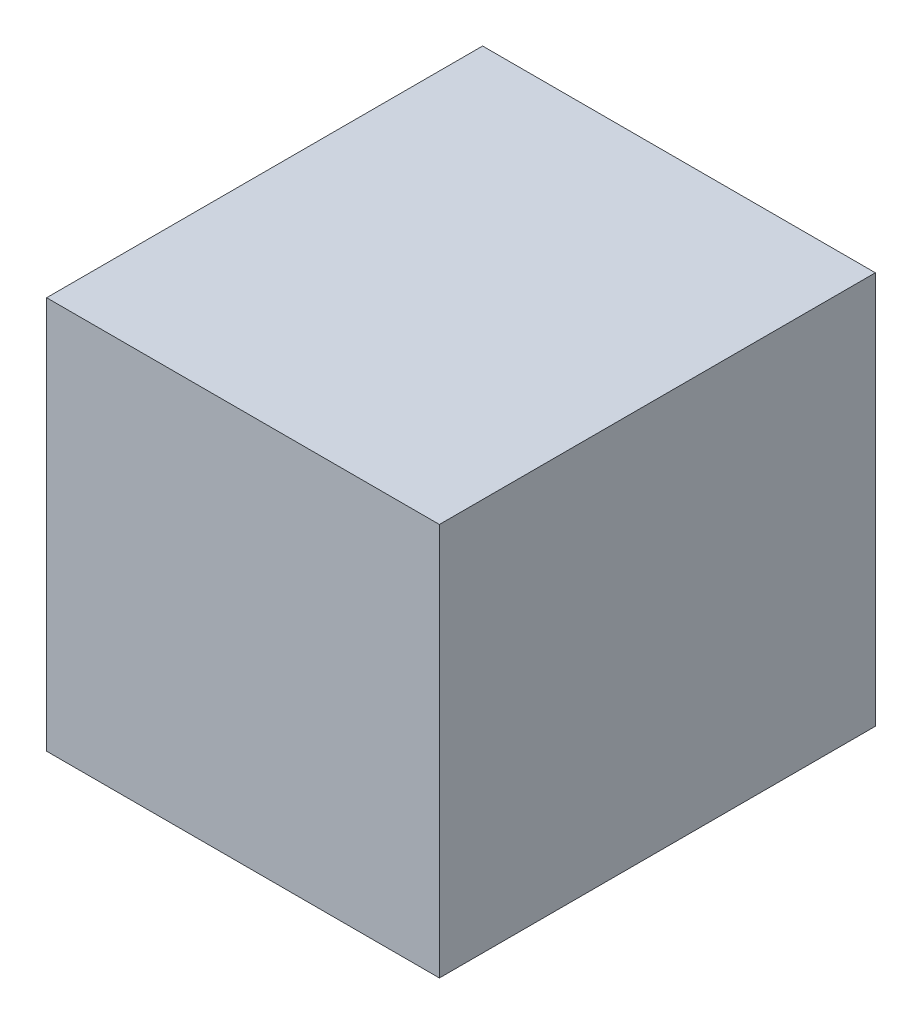
ISO-10303-21;
HEADER;
FILE_DESCRIPTION(('STEP AP214'),'2;1');
FILE_NAME('part.step','',(''),(''),'','','');
FILE_SCHEMA(('AUTOMOTIVE_DESIGN { 1 0 10303 214 1 1 1 1 }'));
ENDSEC;
DATA;
#1=APPLICATION_CONTEXT('core data for automotive mechanical design processes');
#2=APPLICATION_PROTOCOL_DEFINITION('international standard','automotive_design',2000,#1);
#3=PRODUCT_CONTEXT('',#1,'mechanical');
#4=PRODUCT('Part','Part','',(#3));
#5=PRODUCT_RELATED_PRODUCT_CATEGORY('part','',(#4));
#6=PRODUCT_DEFINITION_FORMATION('','',#4);
#7=PRODUCT_DEFINITION_CONTEXT('part definition',#1,'design');
#8=PRODUCT_DEFINITION('design','',#6,#7);
#9=PRODUCT_DEFINITION_SHAPE('','',#8);
#10=(LENGTH_UNIT() NAMED_UNIT(*) SI_UNIT(.MILLI.,.METRE.));
#11=(NAMED_UNIT(*) PLANE_ANGLE_UNIT() SI_UNIT($,.RADIAN.));
#12=(NAMED_UNIT(*) SI_UNIT($,.STERADIAN.) SOLID_ANGLE_UNIT());
#13=UNCERTAINTY_MEASURE_WITH_UNIT(LENGTH_MEASURE(1.E-05),#10,'distance_accuracy_value','');
#14=(GEOMETRIC_REPRESENTATION_CONTEXT(3) GLOBAL_UNCERTAINTY_ASSIGNED_CONTEXT((#13)) GLOBAL_UNIT_ASSIGNED_CONTEXT((#10,
#11,#12)) REPRESENTATION_CONTEXT('',''));
#15=CARTESIAN_POINT('',(0.,0.,0.));
#16=DIRECTION('',(0.,0.,1.));
#17=DIRECTION('',(1.,0.,0.));
#18=AXIS2_PLACEMENT_3D('',#15,#16,#17);
#19=CARTESIAN_POINT('',(5.,10.,5.55));
#20=DIRECTION('',(-1.,0.,0.));
#21=DIRECTION('',(0.,0.,1.));
#22=AXIS2_PLACEMENT_3D('',#19,#20,#21);
#23=PLANE('',#22);
#24=DIRECTION('',(0.,0.,-1.));
#25=VECTOR('',#24,1.);
#26=CARTESIAN_POINT('',(5.,0.,5.55));
#27=LINE('',#26,#25);
#28=CARTESIAN_POINT('',(5.,0.,5.55));
#29=VERTEX_POINT('',#28);
#30=CARTESIAN_POINT('',(5.,0.,-5.55));
#31=VERTEX_POINT('',#30);
#32=EDGE_CURVE('E111',#29,#31,#27,.T.);
#33=ORIENTED_EDGE('',*,*,#32,.T.);
#34=DIRECTION('',(0.,-1.,0.));
#35=VECTOR('',#34,1.);
#36=CARTESIAN_POINT('',(5.,10.,-5.55));
#37=LINE('',#36,#35);
#38=CARTESIAN_POINT('',(5.,10.,-5.55));
#39=VERTEX_POINT('',#38);
#40=EDGE_CURVE('E11',#39,#31,#37,.T.);
#41=ORIENTED_EDGE('',*,*,#40,.F.);
#42=DIRECTION('',(0.,0.,-1.));
#43=VECTOR('',#42,1.);
#44=CARTESIAN_POINT('',(5.,10.,5.55));
#45=LINE('',#44,#43);
#46=CARTESIAN_POINT('',(5.,10.,5.55));
#47=VERTEX_POINT('',#46);
#48=EDGE_CURVE('E95',#47,#39,#45,.T.);
#49=ORIENTED_EDGE('',*,*,#48,.F.);
#50=DIRECTION('',(0.,-1.,0.));
#51=VECTOR('',#50,1.);
#52=CARTESIAN_POINT('',(5.,10.,5.55));
#53=LINE('',#52,#51);
#54=EDGE_CURVE('E107',#47,#29,#53,.T.);
#55=ORIENTED_EDGE('',*,*,#54,.T.);
#56=EDGE_LOOP('',(#33,#41,#49,#55));
#57=FACE_BOUND('',#56,.T.);
#58=ADVANCED_FACE('F43',(#57),#23,.F.);
#59=CARTESIAN_POINT('',(-5.,10.,-5.55));
#60=DIRECTION('',(0.,0.,1.));
#61=DIRECTION('',(1.,0.,0.));
#62=AXIS2_PLACEMENT_3D('',#59,#60,#61);
#63=PLANE('',#62);
#64=DIRECTION('',(-1.,0.,0.));
#65=VECTOR('',#64,1.);
#66=CARTESIAN_POINT('',(-5.,0.,-5.55));
#67=LINE('',#66,#65);
#68=CARTESIAN_POINT('',(-5.,0.,-5.55));
#69=VERTEX_POINT('',#68);
#70=EDGE_CURVE('E100',#31,#69,#67,.T.);
#71=ORIENTED_EDGE('',*,*,#70,.T.);
#72=DIRECTION('',(0.,-1.,0.));
#73=VECTOR('',#72,1.);
#74=CARTESIAN_POINT('',(-5.,10.,-5.55));
#75=LINE('',#74,#73);
#76=CARTESIAN_POINT('',(-5.,10.,-5.55));
#77=VERTEX_POINT('',#76);
#78=EDGE_CURVE('E52',#77,#69,#75,.T.);
#79=ORIENTED_EDGE('',*,*,#78,.F.);
#80=DIRECTION('',(-1.,0.,0.));
#81=VECTOR('',#80,1.);
#82=CARTESIAN_POINT('',(-5.,10.,-5.55));
#83=LINE('',#82,#81);
#84=EDGE_CURVE('E90',#39,#77,#83,.T.);
#85=ORIENTED_EDGE('',*,*,#84,.F.);
#86=ORIENTED_EDGE('',*,*,#40,.T.);
#87=EDGE_LOOP('',(#71,#79,#85,#86));
#88=FACE_BOUND('',#87,.T.);
#89=ADVANCED_FACE('F99',(#88),#63,.F.);
#90=CARTESIAN_POINT('',(-5.,10.,5.55));
#91=DIRECTION('',(1.,0.,0.));
#92=DIRECTION('',(0.,0.,-1.));
#93=AXIS2_PLACEMENT_3D('',#90,#91,#92);
#94=PLANE('',#93);
#95=DIRECTION('',(0.,0.,1.));
#96=VECTOR('',#95,1.);
#97=CARTESIAN_POINT('',(-5.,0.,5.55));
#98=LINE('',#97,#96);
#99=CARTESIAN_POINT('',(-5.,0.,5.55));
#100=VERTEX_POINT('',#99);
#101=EDGE_CURVE('E77',#69,#100,#98,.T.);
#102=ORIENTED_EDGE('',*,*,#101,.T.);
#103=DIRECTION('',(0.,-1.,0.));
#104=VECTOR('',#103,1.);
#105=CARTESIAN_POINT('',(-5.,10.,5.55));
#106=LINE('',#105,#104);
#107=CARTESIAN_POINT('',(-5.,10.,5.55));
#108=VERTEX_POINT('',#107);
#109=EDGE_CURVE('E102',#108,#100,#106,.T.);
#110=ORIENTED_EDGE('',*,*,#109,.F.);
#111=DIRECTION('',(0.,0.,1.));
#112=VECTOR('',#111,1.);
#113=CARTESIAN_POINT('',(-5.,10.,5.55));
#114=LINE('',#113,#112);
#115=EDGE_CURVE('E93',#77,#108,#114,.T.);
#116=ORIENTED_EDGE('',*,*,#115,.F.);
#117=ORIENTED_EDGE('',*,*,#78,.T.);
#118=EDGE_LOOP('',(#102,#110,#116,#117));
#119=FACE_BOUND('',#118,.T.);
#120=ADVANCED_FACE('F103',(#119),#94,.F.);
#121=CARTESIAN_POINT('',(-5.,10.,5.55));
#122=DIRECTION('',(0.,0.,-1.));
#123=DIRECTION('',(-1.,0.,0.));
#124=AXIS2_PLACEMENT_3D('',#121,#122,#123);
#125=PLANE('',#124);
#126=DIRECTION('',(1.,0.,0.));
#127=VECTOR('',#126,1.);
#128=CARTESIAN_POINT('',(-5.,0.,5.55));
#129=LINE('',#128,#127);
#130=EDGE_CURVE('E83',#100,#29,#129,.T.);
#131=ORIENTED_EDGE('',*,*,#130,.T.);
#132=ORIENTED_EDGE('',*,*,#54,.F.);
#133=DIRECTION('',(1.,0.,0.));
#134=VECTOR('',#133,1.);
#135=CARTESIAN_POINT('',(-5.,10.,5.55));
#136=LINE('',#135,#134);
#137=EDGE_CURVE('E60',#108,#47,#136,.T.);
#138=ORIENTED_EDGE('',*,*,#137,.F.);
#139=ORIENTED_EDGE('',*,*,#109,.T.);
#140=EDGE_LOOP('',(#131,#132,#138,#139));
#141=FACE_BOUND('',#140,.T.);
#142=ADVANCED_FACE('F124',(#141),#125,.F.);
#143=CARTESIAN_POINT('',(0.,10.,0.));
#144=DIRECTION('',(0.,-1.,0.));
#145=DIRECTION('',(0.,0.,-1.));
#146=AXIS2_PLACEMENT_3D('',#143,#144,#145);
#147=PLANE('',#146);
#148=ORIENTED_EDGE('',*,*,#48,.T.);
#149=ORIENTED_EDGE('',*,*,#84,.T.);
#150=ORIENTED_EDGE('',*,*,#115,.T.);
#151=ORIENTED_EDGE('',*,*,#137,.T.);
#152=EDGE_LOOP('',(#148,#149,#150,#151));
#153=FACE_BOUND('',#152,.T.);
#154=ADVANCED_FACE('F91',(#153),#147,.F.);
#155=CARTESIAN_POINT('',(0.,0.,0.));
#156=DIRECTION('',(0.,-1.,0.));
#157=DIRECTION('',(0.,0.,-1.));
#158=AXIS2_PLACEMENT_3D('',#155,#156,#157);
#159=PLANE('',#158);
#160=ORIENTED_EDGE('',*,*,#32,.F.);
#161=ORIENTED_EDGE('',*,*,#130,.F.);
#162=ORIENTED_EDGE('',*,*,#101,.F.);
#163=ORIENTED_EDGE('',*,*,#70,.F.);
#164=EDGE_LOOP('',(#160,#161,#162,#163));
#165=FACE_BOUND('',#164,.T.);
#166=ADVANCED_FACE('F127',(#165),#159,.T.);
#167=CLOSED_SHELL('',(#58,#89,#120,#142,#154,#166));
#168=MANIFOLD_SOLID_BREP('B2',#167);
#169=ADVANCED_BREP_SHAPE_REPRESENTATION('',(#18,#168),#14);
#170=SHAPE_DEFINITION_REPRESENTATION(#9,#169);
ENDSEC;
END-ISO-10303-21;
